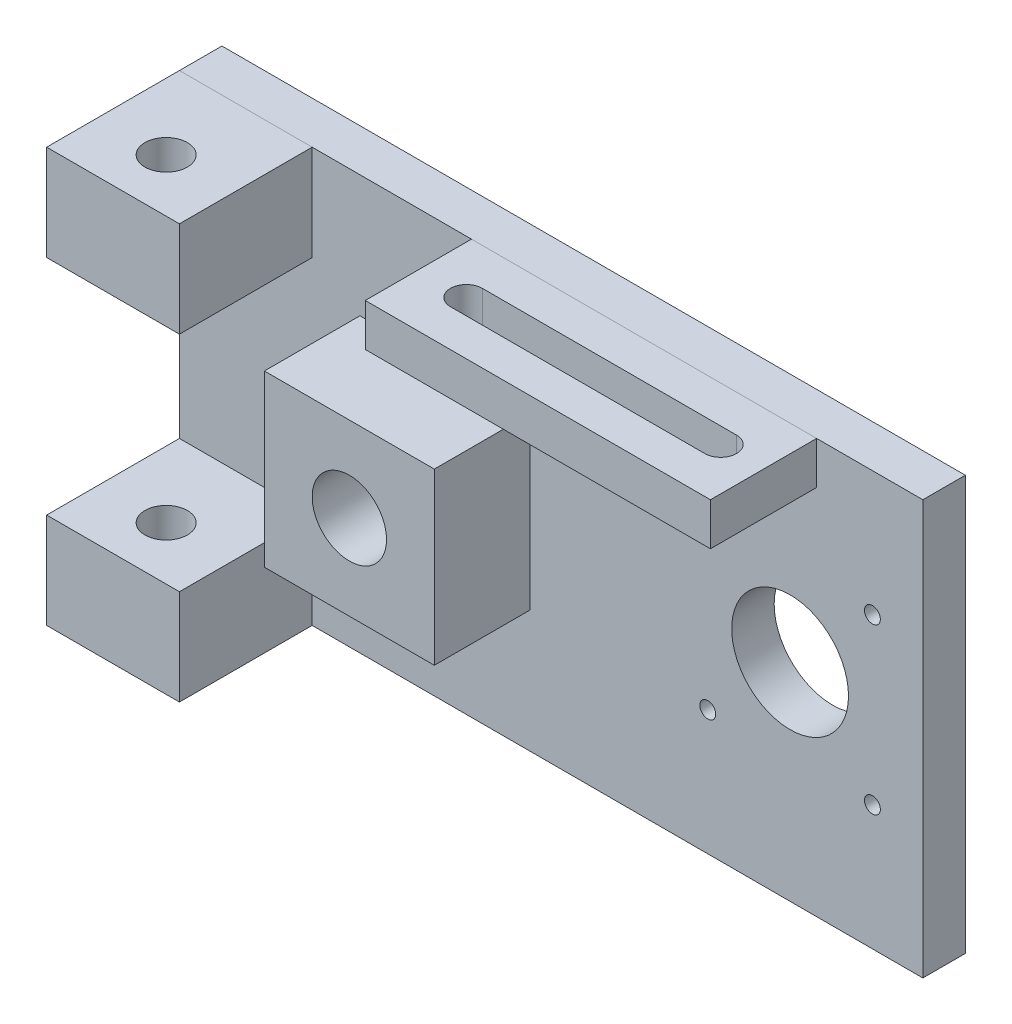
ISO-10303-21;
HEADER;
FILE_DESCRIPTION(('STEP AP214'),'2;1');
FILE_NAME('part.step','',(''),(''),'','','');
FILE_SCHEMA(('AUTOMOTIVE_DESIGN { 1 0 10303 214 1 1 1 1 }'));
ENDSEC;
DATA;
#1=APPLICATION_CONTEXT('core data for automotive mechanical design processes');
#2=APPLICATION_PROTOCOL_DEFINITION('international standard','automotive_design',2000,#1);
#3=PRODUCT_CONTEXT('',#1,'mechanical');
#4=PRODUCT('Part','Part','',(#3));
#5=PRODUCT_RELATED_PRODUCT_CATEGORY('part','',(#4));
#6=PRODUCT_DEFINITION_FORMATION('','',#4);
#7=PRODUCT_DEFINITION_CONTEXT('part definition',#1,'design');
#8=PRODUCT_DEFINITION('design','',#6,#7);
#9=PRODUCT_DEFINITION_SHAPE('','',#8);
#10=(LENGTH_UNIT() NAMED_UNIT(*) SI_UNIT(.MILLI.,.METRE.));
#11=(NAMED_UNIT(*) PLANE_ANGLE_UNIT() SI_UNIT($,.RADIAN.));
#12=(NAMED_UNIT(*) SI_UNIT($,.STERADIAN.) SOLID_ANGLE_UNIT());
#13=UNCERTAINTY_MEASURE_WITH_UNIT(LENGTH_MEASURE(1.E-05),#10,'distance_accuracy_value','');
#14=(GEOMETRIC_REPRESENTATION_CONTEXT(3) GLOBAL_UNCERTAINTY_ASSIGNED_CONTEXT((#13)) GLOBAL_UNIT_ASSIGNED_CONTEXT((#10,
#11,#12)) REPRESENTATION_CONTEXT('',''));
#15=CARTESIAN_POINT('',(0.,0.,0.));
#16=DIRECTION('',(0.,0.,1.));
#17=DIRECTION('',(1.,0.,0.));
#18=AXIS2_PLACEMENT_3D('',#15,#16,#17);
#19=CARTESIAN_POINT('',(50.,39.,28.));
#20=DIRECTION('',(-1.,0.,0.));
#21=DIRECTION('',(0.,0.,1.));
#22=AXIS2_PLACEMENT_3D('',#19,#20,#21);
#23=PLANE('',#22);
#24=DIRECTION('',(0.,1.,0.));
#25=VECTOR('',#24,1.);
#26=CARTESIAN_POINT('',(50.,39.,8.));
#27=LINE('',#26,#25);
#28=CARTESIAN_POINT('',(50.,31.,8.));
#29=VERTEX_POINT('',#28);
#30=CARTESIAN_POINT('',(50.,39.,8.));
#31=VERTEX_POINT('',#30);
#32=EDGE_CURVE('E124',#29,#31,#27,.T.);
#33=ORIENTED_EDGE('',*,*,#32,.T.);
#34=DIRECTION('',(0.,0.,-1.));
#35=VECTOR('',#34,1.);
#36=CARTESIAN_POINT('',(50.,39.,28.));
#37=LINE('',#36,#35);
#38=CARTESIAN_POINT('',(50.,39.,28.));
#39=VERTEX_POINT('',#38);
#40=EDGE_CURVE('E12',#39,#31,#37,.T.);
#41=ORIENTED_EDGE('',*,*,#40,.F.);
#42=DIRECTION('',(0.,1.,0.));
#43=VECTOR('',#42,1.);
#44=CARTESIAN_POINT('',(50.,39.,28.));
#45=LINE('',#44,#43);
#46=CARTESIAN_POINT('',(50.,31.,28.));
#47=VERTEX_POINT('',#46);
#48=EDGE_CURVE('E147',#47,#39,#45,.T.);
#49=ORIENTED_EDGE('',*,*,#48,.F.);
#50=DIRECTION('',(0.,0.,-1.));
#51=VECTOR('',#50,1.);
#52=CARTESIAN_POINT('',(50.,31.,28.));
#53=LINE('',#52,#51);
#54=EDGE_CURVE('E157',#47,#29,#53,.T.);
#55=ORIENTED_EDGE('',*,*,#54,.T.);
#56=EDGE_LOOP('',(#33,#41,#49,#55));
#57=FACE_BOUND('',#56,.T.);
#58=ADVANCED_FACE('F46',(#57),#23,.F.);
#59=CARTESIAN_POINT('',(50.,39.,28.));
#60=DIRECTION('',(0.,-1.,0.));
#61=DIRECTION('',(1.,0.,0.));
#62=AXIS2_PLACEMENT_3D('',#59,#60,#61);
#63=PLANE('',#62);
#64=DIRECTION('',(1.,0.,0.));
#65=VECTOR('',#64,1.);
#66=CARTESIAN_POINT('',(0.,39.,21.));
#67=LINE('',#66,#65);
#68=CARTESIAN_POINT('',(-5.96023281197292,39.,21.));
#69=VERTEX_POINT('',#68);
#70=CARTESIAN_POINT('',(41.9236714740469,39.,21.));
#71=VERTEX_POINT('',#70);
#72=EDGE_CURVE('E132',#69,#71,#67,.T.);
#73=ORIENTED_EDGE('',*,*,#72,.F.);
#74=CARTESIAN_POINT('',(-5.96023281197292,39.,18.));
#75=DIRECTION('',(0.,1.,0.));
#76=DIRECTION('',(-1.,0.,0.));
#77=AXIS2_PLACEMENT_3D('',#74,#75,#76);
#78=CIRCLE('',#77,3.);
#79=CARTESIAN_POINT('',(-5.96023281197292,39.,15.));
#80=VERTEX_POINT('',#79);
#81=EDGE_CURVE('E60',#80,#69,#78,.T.);
#82=ORIENTED_EDGE('',*,*,#81,.F.);
#83=DIRECTION('',(1.,0.,0.));
#84=VECTOR('',#83,1.);
#85=CARTESIAN_POINT('',(0.,39.,15.));
#86=LINE('',#85,#84);
#87=CARTESIAN_POINT('',(41.9236714740469,39.,15.));
#88=VERTEX_POINT('',#87);
#89=EDGE_CURVE('E118',#80,#88,#86,.T.);
#90=ORIENTED_EDGE('',*,*,#89,.T.);
#91=CARTESIAN_POINT('',(41.9236714740469,39.,18.));
#92=DIRECTION('',(0.,1.,0.));
#93=DIRECTION('',(-1.,0.,0.));
#94=AXIS2_PLACEMENT_3D('',#91,#92,#93);
#95=CIRCLE('',#94,3.);
#96=EDGE_CURVE('E138',#71,#88,#95,.T.);
#97=ORIENTED_EDGE('',*,*,#96,.F.);
#98=EDGE_LOOP('',(#73,#82,#90,#97));
#99=FACE_BOUND('',#98,.T.);
#100=DIRECTION('',(-1.,0.,0.));
#101=VECTOR('',#100,1.);
#102=CARTESIAN_POINT('',(50.,39.,8.));
#103=LINE('',#102,#101);
#104=CARTESIAN_POINT('',(-15.,39.,8.));
#105=VERTEX_POINT('',#104);
#106=EDGE_CURVE('E160',#31,#105,#103,.T.);
#107=ORIENTED_EDGE('',*,*,#106,.T.);
#108=DIRECTION('',(0.,0.,-1.));
#109=VECTOR('',#108,1.);
#110=CARTESIAN_POINT('',(-15.,39.,28.));
#111=LINE('',#110,#109);
#112=CARTESIAN_POINT('',(-15.,39.,28.));
#113=VERTEX_POINT('',#112);
#114=EDGE_CURVE('E53',#113,#105,#111,.T.);
#115=ORIENTED_EDGE('',*,*,#114,.F.);
#116=DIRECTION('',(-1.,0.,0.));
#117=VECTOR('',#116,1.);
#118=CARTESIAN_POINT('',(50.,39.,28.));
#119=LINE('',#118,#117);
#120=EDGE_CURVE('E150',#39,#113,#119,.T.);
#121=ORIENTED_EDGE('',*,*,#120,.F.);
#122=ORIENTED_EDGE('',*,*,#40,.T.);
#123=EDGE_LOOP('',(#107,#115,#121,#122));
#124=FACE_BOUND('',#123,.T.);
#125=ADVANCED_FACE('F188',(#99,#124),#63,.F.);
#126=CARTESIAN_POINT('',(-15.,39.,28.));
#127=DIRECTION('',(1.,0.,0.));
#128=DIRECTION('',(0.,0.,-1.));
#129=AXIS2_PLACEMENT_3D('',#126,#127,#128);
#130=PLANE('',#129);
#131=DIRECTION('',(0.,-1.,0.));
#132=VECTOR('',#131,1.);
#133=CARTESIAN_POINT('',(-15.,39.,8.));
#134=LINE('',#133,#132);
#135=CARTESIAN_POINT('',(-15.,31.,8.));
#136=VERTEX_POINT('',#135);
#137=EDGE_CURVE('E162',#105,#136,#134,.T.);
#138=ORIENTED_EDGE('',*,*,#137,.T.);
#139=DIRECTION('',(0.,0.,-1.));
#140=VECTOR('',#139,1.);
#141=CARTESIAN_POINT('',(-15.,31.,28.));
#142=LINE('',#141,#140);
#143=CARTESIAN_POINT('',(-15.,31.,28.));
#144=VERTEX_POINT('',#143);
#145=EDGE_CURVE('E167',#144,#136,#142,.T.);
#146=ORIENTED_EDGE('',*,*,#145,.F.);
#147=DIRECTION('',(0.,-1.,0.));
#148=VECTOR('',#147,1.);
#149=CARTESIAN_POINT('',(-15.,39.,28.));
#150=LINE('',#149,#148);
#151=EDGE_CURVE('E153',#113,#144,#150,.T.);
#152=ORIENTED_EDGE('',*,*,#151,.F.);
#153=ORIENTED_EDGE('',*,*,#114,.T.);
#154=EDGE_LOOP('',(#138,#146,#152,#153));
#155=FACE_BOUND('',#154,.T.);
#156=ADVANCED_FACE('F174',(#155),#130,.F.);
#157=CARTESIAN_POINT('',(50.,31.,28.));
#158=DIRECTION('',(0.,1.,0.));
#159=DIRECTION('',(-1.,0.,0.));
#160=AXIS2_PLACEMENT_3D('',#157,#158,#159);
#161=PLANE('',#160);
#162=DIRECTION('',(-1.,0.,0.));
#163=VECTOR('',#162,1.);
#164=CARTESIAN_POINT('',(0.,31.,15.));
#165=LINE('',#164,#163);
#166=CARTESIAN_POINT('',(41.9236714740469,31.,15.));
#167=VERTEX_POINT('',#166);
#168=CARTESIAN_POINT('',(-5.96023281197292,31.,15.));
#169=VERTEX_POINT('',#168);
#170=EDGE_CURVE('E130',#167,#169,#165,.T.);
#171=ORIENTED_EDGE('',*,*,#170,.T.);
#172=CARTESIAN_POINT('',(-5.96023281197292,31.,18.));
#173=DIRECTION('',(0.,1.,0.));
#174=DIRECTION('',(-1.,0.,0.));
#175=AXIS2_PLACEMENT_3D('',#172,#173,#174);
#176=CIRCLE('',#175,3.);
#177=CARTESIAN_POINT('',(-5.96023281197292,31.,21.));
#178=VERTEX_POINT('',#177);
#179=EDGE_CURVE('E112',#178,#169,#176,.F.);
#180=ORIENTED_EDGE('',*,*,#179,.F.);
#181=DIRECTION('',(-1.,0.,0.));
#182=VECTOR('',#181,1.);
#183=CARTESIAN_POINT('',(0.,31.,21.));
#184=LINE('',#183,#182);
#185=CARTESIAN_POINT('',(41.9236714740469,31.,21.));
#186=VERTEX_POINT('',#185);
#187=EDGE_CURVE('E121',#186,#178,#184,.T.);
#188=ORIENTED_EDGE('',*,*,#187,.F.);
#189=CARTESIAN_POINT('',(41.9236714740469,31.,18.));
#190=DIRECTION('',(0.,1.,0.));
#191=DIRECTION('',(-1.,0.,0.));
#192=AXIS2_PLACEMENT_3D('',#189,#190,#191);
#193=CIRCLE('',#192,3.);
#194=EDGE_CURVE('E68',#167,#186,#193,.F.);
#195=ORIENTED_EDGE('',*,*,#194,.F.);
#196=EDGE_LOOP('',(#171,#180,#188,#195));
#197=FACE_BOUND('',#196,.T.);
#198=DIRECTION('',(1.,0.,0.));
#199=VECTOR('',#198,1.);
#200=CARTESIAN_POINT('',(50.,31.,8.));
#201=LINE('',#200,#199);
#202=EDGE_CURVE('E151',#136,#29,#201,.T.);
#203=ORIENTED_EDGE('',*,*,#202,.T.);
#204=ORIENTED_EDGE('',*,*,#54,.F.);
#205=DIRECTION('',(1.,0.,0.));
#206=VECTOR('',#205,1.);
#207=CARTESIAN_POINT('',(50.,31.,28.));
#208=LINE('',#207,#206);
#209=EDGE_CURVE('E155',#144,#47,#208,.T.);
#210=ORIENTED_EDGE('',*,*,#209,.F.);
#211=ORIENTED_EDGE('',*,*,#145,.T.);
#212=EDGE_LOOP('',(#203,#204,#210,#211));
#213=FACE_BOUND('',#212,.T.);
#214=ADVANCED_FACE('F127',(#197,#213),#161,.F.);
#215=CARTESIAN_POINT('',(0.,0.,28.));
#216=DIRECTION('',(0.,0.,-1.));
#217=DIRECTION('',(-1.,0.,0.));
#218=AXIS2_PLACEMENT_3D('',#215,#216,#217);
#219=PLANE('',#218);
#220=ORIENTED_EDGE('',*,*,#48,.T.);
#221=ORIENTED_EDGE('',*,*,#120,.T.);
#222=ORIENTED_EDGE('',*,*,#151,.T.);
#223=ORIENTED_EDGE('',*,*,#209,.T.);
#224=EDGE_LOOP('',(#220,#221,#222,#223));
#225=FACE_BOUND('',#224,.T.);
#226=ADVANCED_FACE('F187',(#225),#219,.F.);
#227=CARTESIAN_POINT('',(0.,0.,8.));
#228=DIRECTION('',(0.,0.,-1.));
#229=DIRECTION('',(-1.,0.,0.));
#230=AXIS2_PLACEMENT_3D('',#227,#228,#229);
#231=PLANE('',#230);
#232=ORIENTED_EDGE('',*,*,#32,.F.);
#233=ORIENTED_EDGE('',*,*,#202,.F.);
#234=ORIENTED_EDGE('',*,*,#137,.F.);
#235=ORIENTED_EDGE('',*,*,#106,.F.);
#236=EDGE_LOOP('',(#232,#233,#234,#235));
#237=FACE_BOUND('',#236,.T.);
#238=ADVANCED_FACE('F180',(#237),#231,.T.);
#239=CARTESIAN_POINT('',(-5.96023281197291,-39.001,18.));
#240=DIRECTION('',(0.,1.,0.));
#241=DIRECTION('',(-1.,0.,0.));
#242=AXIS2_PLACEMENT_3D('',#239,#240,#241);
#243=CYLINDRICAL_SURFACE('',#242,3.);
#244=ORIENTED_EDGE('',*,*,#179,.T.);
#245=DIRECTION('',(0.,1.,0.));
#246=VECTOR('',#245,1.);
#247=CARTESIAN_POINT('',(-5.96023281197291,-39.001,15.));
#248=LINE('',#247,#246);
#249=EDGE_CURVE('E125',#169,#80,#248,.T.);
#250=ORIENTED_EDGE('',*,*,#249,.T.);
#251=ORIENTED_EDGE('',*,*,#81,.T.);
#252=DIRECTION('',(0.,1.,0.));
#253=VECTOR('',#252,1.);
#254=CARTESIAN_POINT('',(-5.96023281197291,-39.001,21.));
#255=LINE('',#254,#253);
#256=EDGE_CURVE('E108',#178,#69,#255,.T.);
#257=ORIENTED_EDGE('',*,*,#256,.F.);
#258=EDGE_LOOP('',(#244,#250,#251,#257));
#259=FACE_BOUND('',#258,.T.);
#260=ADVANCED_FACE('F110',(#259),#243,.F.);
#261=CARTESIAN_POINT('',(0.,-39.001,15.));
#262=DIRECTION('',(0.,0.,1.));
#263=DIRECTION('',(1.,0.,0.));
#264=AXIS2_PLACEMENT_3D('',#261,#262,#263);
#265=PLANE('',#264);
#266=DIRECTION('',(0.,1.,0.));
#267=VECTOR('',#266,1.);
#268=CARTESIAN_POINT('',(41.9236714740469,-39.001,15.));
#269=LINE('',#268,#267);
#270=EDGE_CURVE('E144',#167,#88,#269,.T.);
#271=ORIENTED_EDGE('',*,*,#270,.T.);
#272=ORIENTED_EDGE('',*,*,#89,.F.);
#273=ORIENTED_EDGE('',*,*,#249,.F.);
#274=ORIENTED_EDGE('',*,*,#170,.F.);
#275=EDGE_LOOP('',(#271,#272,#273,#274));
#276=FACE_BOUND('',#275,.T.);
#277=ADVANCED_FACE('F205',(#276),#265,.T.);
#278=CARTESIAN_POINT('',(41.9236714740469,-39.001,18.));
#279=DIRECTION('',(0.,1.,0.));
#280=DIRECTION('',(-1.,0.,0.));
#281=AXIS2_PLACEMENT_3D('',#278,#279,#280);
#282=CYLINDRICAL_SURFACE('',#281,3.);
#283=ORIENTED_EDGE('',*,*,#194,.T.);
#284=DIRECTION('',(0.,1.,0.));
#285=VECTOR('',#284,1.);
#286=CARTESIAN_POINT('',(41.9236714740469,-39.001,21.));
#287=LINE('',#286,#285);
#288=EDGE_CURVE('E117',#186,#71,#287,.T.);
#289=ORIENTED_EDGE('',*,*,#288,.T.);
#290=ORIENTED_EDGE('',*,*,#96,.T.);
#291=ORIENTED_EDGE('',*,*,#270,.F.);
#292=EDGE_LOOP('',(#283,#289,#290,#291));
#293=FACE_BOUND('',#292,.T.);
#294=ADVANCED_FACE('F208',(#293),#282,.F.);
#295=CARTESIAN_POINT('',(0.,-39.001,21.));
#296=DIRECTION('',(0.,0.,1.));
#297=DIRECTION('',(1.,0.,0.));
#298=AXIS2_PLACEMENT_3D('',#295,#296,#297);
#299=PLANE('',#298);
#300=ORIENTED_EDGE('',*,*,#187,.T.);
#301=ORIENTED_EDGE('',*,*,#256,.T.);
#302=ORIENTED_EDGE('',*,*,#72,.T.);
#303=ORIENTED_EDGE('',*,*,#288,.F.);
#304=EDGE_LOOP('',(#300,#301,#302,#303));
#305=FACE_BOUND('',#304,.T.);
#306=ADVANCED_FACE('F122',(#305),#299,.F.);
#307=CLOSED_SHELL('',(#58,#125,#156,#214,#226,#238,#260,#277,#294,#306));
#308=MANIFOLD_SOLID_BREP('B2',#307);
#309=CARTESIAN_POINT('',(0.,-39.,33.));
#310=DIRECTION('',(0.,1.,0.));
#311=DIRECTION('',(0.,0.,1.));
#312=AXIS2_PLACEMENT_3D('',#309,#310,#311);
#313=PLANE('',#312);
#314=CARTESIAN_POINT('',(-57.5,-39.,23.0000000000002));
#315=DIRECTION('',(0.,1.,0.));
#316=DIRECTION('',(0.,0.,1.));
#317=AXIS2_PLACEMENT_3D('',#314,#315,#316);
#318=CIRCLE('',#317,4.00000000000001);
#319=CARTESIAN_POINT('',(-57.5,-39.,27.0000000000002));
#320=VERTEX_POINT('',#319);
#321=EDGE_CURVE('E381',#320,#320,#318,.T.);
#322=ORIENTED_EDGE('',*,*,#321,.T.);
#323=EDGE_LOOP('',(#322));
#324=FACE_BOUND('',#323,.T.);
#325=DIRECTION('',(1.,0.,0.));
#326=VECTOR('',#325,1.);
#327=CARTESIAN_POINT('',(0.,-39.,8.));
#328=LINE('',#327,#326);
#329=CARTESIAN_POINT('',(-70.,-39.,8.));
#330=VERTEX_POINT('',#329);
#331=CARTESIAN_POINT('',(-45.,-39.,8.));
#332=VERTEX_POINT('',#331);
#333=EDGE_CURVE('E350',#330,#332,#328,.T.);
#334=ORIENTED_EDGE('',*,*,#333,.T.);
#335=DIRECTION('',(0.,0.,-1.));
#336=VECTOR('',#335,1.);
#337=CARTESIAN_POINT('',(-45.,-39.,33.));
#338=LINE('',#337,#336);
#339=CARTESIAN_POINT('',(-45.,-39.,33.));
#340=VERTEX_POINT('',#339);
#341=EDGE_CURVE('E44',#340,#332,#338,.T.);
#342=ORIENTED_EDGE('',*,*,#341,.F.);
#343=DIRECTION('',(1.,0.,0.));
#344=VECTOR('',#343,1.);
#345=CARTESIAN_POINT('',(0.,-39.,33.));
#346=LINE('',#345,#344);
#347=CARTESIAN_POINT('',(-70.,-39.,33.));
#348=VERTEX_POINT('',#347);
#349=EDGE_CURVE('E334',#348,#340,#346,.T.);
#350=ORIENTED_EDGE('',*,*,#349,.F.);
#351=DIRECTION('',(0.,0.,-1.));
#352=VECTOR('',#351,1.);
#353=CARTESIAN_POINT('',(-70.,-39.,33.));
#354=LINE('',#353,#352);
#355=EDGE_CURVE('E346',#348,#330,#354,.T.);
#356=ORIENTED_EDGE('',*,*,#355,.T.);
#357=EDGE_LOOP('',(#334,#342,#350,#356));
#358=FACE_BOUND('',#357,.T.);
#359=ADVANCED_FACE('F286',(#324,#358),#313,.F.);
#360=CARTESIAN_POINT('',(-45.,0.,33.));
#361=DIRECTION('',(-1.,0.,0.));
#362=DIRECTION('',(0.,0.,1.));
#363=AXIS2_PLACEMENT_3D('',#360,#361,#362);
#364=PLANE('',#363);
#365=DIRECTION('',(0.,1.,0.));
#366=VECTOR('',#365,1.);
#367=CARTESIAN_POINT('',(-45.,0.,8.));
#368=LINE('',#367,#366);
#369=CARTESIAN_POINT('',(-45.,-21.,8.));
#370=VERTEX_POINT('',#369);
#371=EDGE_CURVE('E339',#332,#370,#368,.T.);
#372=ORIENTED_EDGE('',*,*,#371,.T.);
#373=DIRECTION('',(0.,0.,-1.));
#374=VECTOR('',#373,1.);
#375=CARTESIAN_POINT('',(-45.,-21.,33.));
#376=LINE('',#375,#374);
#377=CARTESIAN_POINT('',(-45.,-21.,33.));
#378=VERTEX_POINT('',#377);
#379=EDGE_CURVE('E295',#378,#370,#376,.T.);
#380=ORIENTED_EDGE('',*,*,#379,.F.);
#381=DIRECTION('',(0.,1.,0.));
#382=VECTOR('',#381,1.);
#383=CARTESIAN_POINT('',(-45.,0.,33.));
#384=LINE('',#383,#382);
#385=EDGE_CURVE('E329',#340,#378,#384,.T.);
#386=ORIENTED_EDGE('',*,*,#385,.F.);
#387=ORIENTED_EDGE('',*,*,#341,.T.);
#388=EDGE_LOOP('',(#372,#380,#386,#387));
#389=FACE_BOUND('',#388,.T.);
#390=ADVANCED_FACE('F338',(#389),#364,.F.);
#391=CARTESIAN_POINT('',(0.,-21.,33.));
#392=DIRECTION('',(0.,1.,0.));
#393=DIRECTION('',(-1.,0.,0.));
#394=AXIS2_PLACEMENT_3D('',#391,#392,#393);
#395=PLANE('',#394);
#396=CARTESIAN_POINT('',(-57.5,-21.,23.0000000000002));
#397=DIRECTION('',(0.,1.,0.));
#398=DIRECTION('',(-1.,0.,0.));
#399=AXIS2_PLACEMENT_3D('',#396,#397,#398);
#400=CIRCLE('',#399,4.00000000000001);
#401=CARTESIAN_POINT('',(-61.5,-21.,23.0000000000002));
#402=VERTEX_POINT('',#401);
#403=EDGE_CURVE('E289',#402,#402,#400,.T.);
#404=ORIENTED_EDGE('',*,*,#403,.F.);
#405=EDGE_LOOP('',(#404));
#406=FACE_BOUND('',#405,.T.);
#407=DIRECTION('',(1.,0.,0.));
#408=VECTOR('',#407,1.);
#409=CARTESIAN_POINT('',(0.,-21.,8.));
#410=LINE('',#409,#408);
#411=CARTESIAN_POINT('',(-70.,-21.,8.));
#412=VERTEX_POINT('',#411);
#413=EDGE_CURVE('E354',#412,#370,#410,.T.);
#414=ORIENTED_EDGE('',*,*,#413,.F.);
#415=DIRECTION('',(0.,0.,-1.));
#416=VECTOR('',#415,1.);
#417=CARTESIAN_POINT('',(-70.,-21.,33.));
#418=LINE('',#417,#416);
#419=CARTESIAN_POINT('',(-70.,-21.,33.));
#420=VERTEX_POINT('',#419);
#421=EDGE_CURVE('E319',#420,#412,#418,.T.);
#422=ORIENTED_EDGE('',*,*,#421,.F.);
#423=DIRECTION('',(1.,0.,0.));
#424=VECTOR('',#423,1.);
#425=CARTESIAN_POINT('',(0.,-21.,33.));
#426=LINE('',#425,#424);
#427=EDGE_CURVE('E332',#420,#378,#426,.T.);
#428=ORIENTED_EDGE('',*,*,#427,.T.);
#429=ORIENTED_EDGE('',*,*,#379,.T.);
#430=EDGE_LOOP('',(#414,#422,#428,#429));
#431=FACE_BOUND('',#430,.T.);
#432=ADVANCED_FACE('F344',(#406,#431),#395,.T.);
#433=CARTESIAN_POINT('',(-70.,0.,33.));
#434=DIRECTION('',(1.,0.,0.));
#435=DIRECTION('',(0.,0.,-1.));
#436=AXIS2_PLACEMENT_3D('',#433,#434,#435);
#437=PLANE('',#436);
#438=DIRECTION('',(0.,-1.,0.));
#439=VECTOR('',#438,1.);
#440=CARTESIAN_POINT('',(-70.,0.,8.));
#441=LINE('',#440,#439);
#442=EDGE_CURVE('E322',#412,#330,#441,.T.);
#443=ORIENTED_EDGE('',*,*,#442,.T.);
#444=ORIENTED_EDGE('',*,*,#355,.F.);
#445=DIRECTION('',(0.,-1.,0.));
#446=VECTOR('',#445,1.);
#447=CARTESIAN_POINT('',(-70.,0.,33.));
#448=LINE('',#447,#446);
#449=EDGE_CURVE('E303',#420,#348,#448,.T.);
#450=ORIENTED_EDGE('',*,*,#449,.F.);
#451=ORIENTED_EDGE('',*,*,#421,.T.);
#452=EDGE_LOOP('',(#443,#444,#450,#451));
#453=FACE_BOUND('',#452,.T.);
#454=ADVANCED_FACE('F371',(#453),#437,.F.);
#455=CARTESIAN_POINT('',(0.,0.,33.));
#456=DIRECTION('',(0.,0.,1.));
#457=DIRECTION('',(1.,0.,0.));
#458=AXIS2_PLACEMENT_3D('',#455,#456,#457);
#459=PLANE('',#458);
#460=ORIENTED_EDGE('',*,*,#349,.T.);
#461=ORIENTED_EDGE('',*,*,#385,.T.);
#462=ORIENTED_EDGE('',*,*,#427,.F.);
#463=ORIENTED_EDGE('',*,*,#449,.T.);
#464=EDGE_LOOP('',(#460,#461,#462,#463));
#465=FACE_BOUND('',#464,.T.);
#466=ADVANCED_FACE('F330',(#465),#459,.T.);
#467=CARTESIAN_POINT('',(0.,0.,8.));
#468=DIRECTION('',(0.,0.,1.));
#469=DIRECTION('',(1.,0.,0.));
#470=AXIS2_PLACEMENT_3D('',#467,#468,#469);
#471=PLANE('',#470);
#472=ORIENTED_EDGE('',*,*,#333,.F.);
#473=ORIENTED_EDGE('',*,*,#442,.F.);
#474=ORIENTED_EDGE('',*,*,#413,.T.);
#475=ORIENTED_EDGE('',*,*,#371,.F.);
#476=EDGE_LOOP('',(#472,#473,#474,#475));
#477=FACE_BOUND('',#476,.T.);
#478=ADVANCED_FACE('F361',(#477),#471,.F.);
#479=CARTESIAN_POINT('',(-57.5,-39.,23.0000000000002));
#480=DIRECTION('',(0.,1.,0.));
#481=DIRECTION('',(0.,0.,1.));
#482=AXIS2_PLACEMENT_3D('',#479,#480,#481);
#483=CYLINDRICAL_SURFACE('',#482,4.00000000000001);
#484=ORIENTED_EDGE('',*,*,#403,.T.);
#485=EDGE_LOOP('',(#484));
#486=FACE_BOUND('',#485,.T.);
#487=ORIENTED_EDGE('',*,*,#321,.F.);
#488=EDGE_LOOP('',(#487));
#489=FACE_BOUND('',#488,.T.);
#490=ADVANCED_FACE('F363',(#486,#489),#483,.F.);
#491=CLOSED_SHELL('',(#359,#390,#432,#454,#466,#478,#490));
#492=MANIFOLD_SOLID_BREP('B6',#491);
#493=CARTESIAN_POINT('',(-45.,0.,33.));
#494=DIRECTION('',(1.,0.,0.));
#495=DIRECTION('',(0.,1.,0.));
#496=AXIS2_PLACEMENT_3D('',#493,#494,#495);
#497=PLANE('',#496);
#498=DIRECTION('',(0.,-1.,0.));
#499=VECTOR('',#498,1.);
#500=CARTESIAN_POINT('',(-45.,0.,8.));
#501=LINE('',#500,#499);
#502=CARTESIAN_POINT('',(-45.,39.,8.));
#503=VERTEX_POINT('',#502);
#504=CARTESIAN_POINT('',(-45.,21.,8.));
#505=VERTEX_POINT('',#504);
#506=EDGE_CURVE('E510',#503,#505,#501,.T.);
#507=ORIENTED_EDGE('',*,*,#506,.F.);
#508=DIRECTION('',(0.,0.,-1.));
#509=VECTOR('',#508,1.);
#510=CARTESIAN_POINT('',(-45.,39.,33.));
#511=LINE('',#510,#509);
#512=CARTESIAN_POINT('',(-45.,39.,33.));
#513=VERTEX_POINT('',#512);
#514=EDGE_CURVE('E284',#513,#503,#511,.T.);
#515=ORIENTED_EDGE('',*,*,#514,.F.);
#516=DIRECTION('',(0.,-1.,0.));
#517=VECTOR('',#516,1.);
#518=CARTESIAN_POINT('',(-45.,0.,33.));
#519=LINE('',#518,#517);
#520=CARTESIAN_POINT('',(-45.,21.,33.));
#521=VERTEX_POINT('',#520);
#522=EDGE_CURVE('E497',#513,#521,#519,.T.);
#523=ORIENTED_EDGE('',*,*,#522,.T.);
#524=DIRECTION('',(0.,0.,-1.));
#525=VECTOR('',#524,1.);
#526=CARTESIAN_POINT('',(-45.,21.,33.));
#527=LINE('',#526,#525);
#528=EDGE_CURVE('E486',#521,#505,#527,.T.);
#529=ORIENTED_EDGE('',*,*,#528,.T.);
#530=EDGE_LOOP('',(#507,#515,#523,#529));
#531=FACE_BOUND('',#530,.T.);
#532=ADVANCED_FACE('F446',(#531),#497,.T.);
#533=CARTESIAN_POINT('',(0.,39.,33.));
#534=DIRECTION('',(0.,-1.,0.));
#535=DIRECTION('',(0.,0.,-1.));
#536=AXIS2_PLACEMENT_3D('',#533,#534,#535);
#537=PLANE('',#536);
#538=CARTESIAN_POINT('',(-57.5,39.,23.0000000000002));
#539=DIRECTION('',(0.,1.,0.));
#540=DIRECTION('',(0.,0.,1.));
#541=AXIS2_PLACEMENT_3D('',#538,#539,#540);
#542=CIRCLE('',#541,4.00000000000001);
#543=CARTESIAN_POINT('',(-57.5,39.,27.0000000000002));
#544=VERTEX_POINT('',#543);
#545=EDGE_CURVE('E548',#544,#544,#542,.T.);
#546=ORIENTED_EDGE('',*,*,#545,.F.);
#547=EDGE_LOOP('',(#546));
#548=FACE_BOUND('',#547,.T.);
#549=DIRECTION('',(-1.,0.,0.));
#550=VECTOR('',#549,1.);
#551=CARTESIAN_POINT('',(0.,39.,8.));
#552=LINE('',#551,#550);
#553=CARTESIAN_POINT('',(-70.,39.,8.));
#554=VERTEX_POINT('',#553);
#555=EDGE_CURVE('E502',#503,#554,#552,.T.);
#556=ORIENTED_EDGE('',*,*,#555,.T.);
#557=DIRECTION('',(0.,0.,-1.));
#558=VECTOR('',#557,1.);
#559=CARTESIAN_POINT('',(-70.,39.,33.));
#560=LINE('',#559,#558);
#561=CARTESIAN_POINT('',(-70.,39.,33.));
#562=VERTEX_POINT('',#561);
#563=EDGE_CURVE('E455',#562,#554,#560,.T.);
#564=ORIENTED_EDGE('',*,*,#563,.F.);
#565=DIRECTION('',(-1.,0.,0.));
#566=VECTOR('',#565,1.);
#567=CARTESIAN_POINT('',(0.,39.,33.));
#568=LINE('',#567,#566);
#569=EDGE_CURVE('E492',#513,#562,#568,.T.);
#570=ORIENTED_EDGE('',*,*,#569,.F.);
#571=ORIENTED_EDGE('',*,*,#514,.T.);
#572=EDGE_LOOP('',(#556,#564,#570,#571));
#573=FACE_BOUND('',#572,.T.);
#574=ADVANCED_FACE('F500',(#548,#573),#537,.F.);
#575=CARTESIAN_POINT('',(-70.,0.,33.));
#576=DIRECTION('',(1.,0.,0.));
#577=DIRECTION('',(0.,0.,-1.));
#578=AXIS2_PLACEMENT_3D('',#575,#576,#577);
#579=PLANE('',#578);
#580=DIRECTION('',(0.,-1.,0.));
#581=VECTOR('',#580,1.);
#582=CARTESIAN_POINT('',(-70.,0.,8.));
#583=LINE('',#582,#581);
#584=CARTESIAN_POINT('',(-70.,21.,8.));
#585=VERTEX_POINT('',#584);
#586=EDGE_CURVE('E479',#554,#585,#583,.T.);
#587=ORIENTED_EDGE('',*,*,#586,.T.);
#588=DIRECTION('',(0.,0.,-1.));
#589=VECTOR('',#588,1.);
#590=CARTESIAN_POINT('',(-70.,21.,33.));
#591=LINE('',#590,#589);
#592=CARTESIAN_POINT('',(-70.,21.,33.));
#593=VERTEX_POINT('',#592);
#594=EDGE_CURVE('E503',#593,#585,#591,.T.);
#595=ORIENTED_EDGE('',*,*,#594,.F.);
#596=DIRECTION('',(0.,-1.,0.));
#597=VECTOR('',#596,1.);
#598=CARTESIAN_POINT('',(-70.,0.,33.));
#599=LINE('',#598,#597);
#600=EDGE_CURVE('E496',#562,#593,#599,.T.);
#601=ORIENTED_EDGE('',*,*,#600,.F.);
#602=ORIENTED_EDGE('',*,*,#563,.T.);
#603=EDGE_LOOP('',(#587,#595,#601,#602));
#604=FACE_BOUND('',#603,.T.);
#605=ADVANCED_FACE('F505',(#604),#579,.F.);
#606=CARTESIAN_POINT('',(0.,21.,33.));
#607=DIRECTION('',(0.,1.,0.));
#608=DIRECTION('',(0.,0.,1.));
#609=AXIS2_PLACEMENT_3D('',#606,#607,#608);
#610=PLANE('',#609);
#611=CARTESIAN_POINT('',(-57.5,21.,23.0000000000002));
#612=DIRECTION('',(0.,1.,0.));
#613=DIRECTION('',(0.,0.,1.));
#614=AXIS2_PLACEMENT_3D('',#611,#612,#613);
#615=CIRCLE('',#614,4.00000000000001);
#616=CARTESIAN_POINT('',(-57.5,21.,27.0000000000002));
#617=VERTEX_POINT('',#616);
#618=EDGE_CURVE('E449',#617,#617,#615,.T.);
#619=ORIENTED_EDGE('',*,*,#618,.T.);
#620=EDGE_LOOP('',(#619));
#621=FACE_BOUND('',#620,.T.);
#622=DIRECTION('',(1.,0.,0.));
#623=VECTOR('',#622,1.);
#624=CARTESIAN_POINT('',(0.,21.,8.));
#625=LINE('',#624,#623);
#626=EDGE_CURVE('E515',#585,#505,#625,.T.);
#627=ORIENTED_EDGE('',*,*,#626,.T.);
#628=ORIENTED_EDGE('',*,*,#528,.F.);
#629=DIRECTION('',(1.,0.,0.));
#630=VECTOR('',#629,1.);
#631=CARTESIAN_POINT('',(0.,21.,33.));
#632=LINE('',#631,#630);
#633=EDGE_CURVE('E463',#593,#521,#632,.T.);
#634=ORIENTED_EDGE('',*,*,#633,.F.);
#635=ORIENTED_EDGE('',*,*,#594,.T.);
#636=EDGE_LOOP('',(#627,#628,#634,#635));
#637=FACE_BOUND('',#636,.T.);
#638=ADVANCED_FACE('F520',(#621,#637),#610,.F.);
#639=CARTESIAN_POINT('',(0.,0.,33.));
#640=DIRECTION('',(0.,0.,1.));
#641=DIRECTION('',(1.,0.,0.));
#642=AXIS2_PLACEMENT_3D('',#639,#640,#641);
#643=PLANE('',#642);
#644=ORIENTED_EDGE('',*,*,#522,.F.);
#645=ORIENTED_EDGE('',*,*,#569,.T.);
#646=ORIENTED_EDGE('',*,*,#600,.T.);
#647=ORIENTED_EDGE('',*,*,#633,.T.);
#648=EDGE_LOOP('',(#644,#645,#646,#647));
#649=FACE_BOUND('',#648,.T.);
#650=ADVANCED_FACE('F494',(#649),#643,.T.);
#651=CARTESIAN_POINT('',(0.,0.,8.));
#652=DIRECTION('',(0.,0.,1.));
#653=DIRECTION('',(1.,0.,0.));
#654=AXIS2_PLACEMENT_3D('',#651,#652,#653);
#655=PLANE('',#654);
#656=ORIENTED_EDGE('',*,*,#506,.T.);
#657=ORIENTED_EDGE('',*,*,#626,.F.);
#658=ORIENTED_EDGE('',*,*,#586,.F.);
#659=ORIENTED_EDGE('',*,*,#555,.F.);
#660=EDGE_LOOP('',(#656,#657,#658,#659));
#661=FACE_BOUND('',#660,.T.);
#662=ADVANCED_FACE('F522',(#661),#655,.F.);
#663=CARTESIAN_POINT('',(-57.5,-39.,23.0000000000002));
#664=DIRECTION('',(0.,1.,0.));
#665=DIRECTION('',(0.,0.,1.));
#666=AXIS2_PLACEMENT_3D('',#663,#664,#665);
#667=CYLINDRICAL_SURFACE('',#666,4.00000000000001);
#668=ORIENTED_EDGE('',*,*,#545,.T.);
#669=EDGE_LOOP('',(#668));
#670=FACE_BOUND('',#669,.T.);
#671=ORIENTED_EDGE('',*,*,#618,.F.);
#672=EDGE_LOOP('',(#671));
#673=FACE_BOUND('',#672,.T.);
#674=ADVANCED_FACE('F539',(#670,#673),#667,.F.);
#675=CLOSED_SHELL('',(#532,#574,#605,#638,#650,#662,#674));
#676=MANIFOLD_SOLID_BREP('B38',#675);
#677=CARTESIAN_POINT('',(0.,0.,8.));
#678=DIRECTION('',(0.,0.,-1.));
#679=DIRECTION('',(-1.,0.,0.));
#680=AXIS2_PLACEMENT_3D('',#677,#678,#679);
#681=PLANE('',#680);
#682=DIRECTION('',(0.,1.,0.));
#683=VECTOR('',#682,1.);
#684=CARTESIAN_POINT('',(70.,-39.,8.));
#685=LINE('',#684,#683);
#686=CARTESIAN_POINT('',(70.,-39.,8.));
#687=VERTEX_POINT('',#686);
#688=CARTESIAN_POINT('',(70.,39.,8.));
#689=VERTEX_POINT('',#688);
#690=EDGE_CURVE('E742',#687,#689,#685,.T.);
#691=ORIENTED_EDGE('',*,*,#690,.T.);
#692=DIRECTION('',(-1.,0.,0.));
#693=VECTOR('',#692,1.);
#694=CARTESIAN_POINT('',(-70.,39.,8.));
#695=LINE('',#694,#693);
#696=CARTESIAN_POINT('',(-70.,39.,8.));
#697=VERTEX_POINT('',#696);
#698=EDGE_CURVE('E745',#689,#697,#695,.T.);
#699=ORIENTED_EDGE('',*,*,#698,.T.);
#700=DIRECTION('',(0.,-1.,0.));
#701=VECTOR('',#700,1.);
#702=CARTESIAN_POINT('',(-70.,-39.,8.));
#703=LINE('',#702,#701);
#704=CARTESIAN_POINT('',(-70.,-39.,8.));
#705=VERTEX_POINT('',#704);
#706=EDGE_CURVE('E748',#697,#705,#703,.T.);
#707=ORIENTED_EDGE('',*,*,#706,.T.);
#708=DIRECTION('',(1.,0.,0.));
#709=VECTOR('',#708,1.);
#710=CARTESIAN_POINT('',(-70.,-39.,8.));
#711=LINE('',#710,#709);
#712=EDGE_CURVE('E750',#705,#687,#711,.T.);
#713=ORIENTED_EDGE('',*,*,#712,.T.);
#714=EDGE_LOOP('',(#691,#699,#707,#713));
#715=FACE_BOUND('',#714,.T.);
#716=CARTESIAN_POINT('',(60.5,15.5,8.));
#717=DIRECTION('',(0.,0.,1.));
#718=DIRECTION('',(1.,0.,0.));
#719=AXIS2_PLACEMENT_3D('',#716,#717,#718);
#720=CIRCLE('',#719,1.5);
#721=CARTESIAN_POINT('',(62.,15.5,8.));
#722=VERTEX_POINT('',#721);
#723=EDGE_CURVE('E736',#722,#722,#720,.T.);
#724=ORIENTED_EDGE('',*,*,#723,.F.);
#725=EDGE_LOOP('',(#724));
#726=FACE_BOUND('',#725,.T.);
#727=CARTESIAN_POINT('',(45.,0.,8.));
#728=DIRECTION('',(0.,0.,1.));
#729=DIRECTION('',(1.,0.,0.));
#730=AXIS2_PLACEMENT_3D('',#727,#728,#729);
#731=CIRCLE('',#730,11.);
#732=CARTESIAN_POINT('',(56.,0.,8.));
#733=VERTEX_POINT('',#732);
#734=EDGE_CURVE('E709',#733,#733,#731,.T.);
#735=ORIENTED_EDGE('',*,*,#734,.F.);
#736=EDGE_LOOP('',(#735));
#737=FACE_BOUND('',#736,.T.);
#738=CARTESIAN_POINT('',(29.5,15.5,8.));
#739=DIRECTION('',(0.,0.,1.));
#740=DIRECTION('',(1.,0.,0.));
#741=AXIS2_PLACEMENT_3D('',#738,#739,#740);
#742=CIRCLE('',#741,1.5);
#743=CARTESIAN_POINT('',(31.,15.5,8.));
#744=VERTEX_POINT('',#743);
#745=EDGE_CURVE('E724',#744,#744,#742,.T.);
#746=ORIENTED_EDGE('',*,*,#745,.F.);
#747=EDGE_LOOP('',(#746));
#748=FACE_BOUND('',#747,.T.);
#749=CARTESIAN_POINT('',(60.5,-15.5,8.));
#750=DIRECTION('',(0.,0.,1.));
#751=DIRECTION('',(1.,0.,0.));
#752=AXIS2_PLACEMENT_3D('',#749,#750,#751);
#753=CIRCLE('',#752,1.5);
#754=CARTESIAN_POINT('',(62.,-15.5,8.));
#755=VERTEX_POINT('',#754);
#756=EDGE_CURVE('E731',#755,#755,#753,.T.);
#757=ORIENTED_EDGE('',*,*,#756,.F.);
#758=EDGE_LOOP('',(#757));
#759=FACE_BOUND('',#758,.T.);
#760=CARTESIAN_POINT('',(29.5,-15.5,8.));
#761=DIRECTION('',(0.,0.,1.));
#762=DIRECTION('',(1.,0.,0.));
#763=AXIS2_PLACEMENT_3D('',#760,#761,#762);
#764=CIRCLE('',#763,1.5);
#765=CARTESIAN_POINT('',(31.,-15.5,8.));
#766=VERTEX_POINT('',#765);
#767=EDGE_CURVE('E715',#766,#766,#764,.T.);
#768=ORIENTED_EDGE('',*,*,#767,.F.);
#769=EDGE_LOOP('',(#768));
#770=FACE_BOUND('',#769,.T.);
#771=DIRECTION('',(0.,1.,0.));
#772=VECTOR('',#771,1.);
#773=CARTESIAN_POINT('',(-4.00000000000002,-16.0000000000001,8.));
#774=LINE('',#773,#772);
#775=CARTESIAN_POINT('',(-4.00000000000002,-16.0000000000001,8.));
#776=VERTEX_POINT('',#775);
#777=CARTESIAN_POINT('',(-4.00000000000002,15.9999999999999,8.));
#778=VERTEX_POINT('',#777);
#779=EDGE_CURVE('E698',#776,#778,#774,.T.);
#780=ORIENTED_EDGE('',*,*,#779,.F.);
#781=DIRECTION('',(1.,0.,0.));
#782=VECTOR('',#781,1.);
#783=CARTESIAN_POINT('',(-36.,-16.0000000000001,8.));
#784=LINE('',#783,#782);
#785=CARTESIAN_POINT('',(-36.,-16.0000000000001,8.));
#786=VERTEX_POINT('',#785);
#787=EDGE_CURVE('E667',#786,#776,#784,.T.);
#788=ORIENTED_EDGE('',*,*,#787,.F.);
#789=DIRECTION('',(0.,-1.,0.));
#790=VECTOR('',#789,1.);
#791=CARTESIAN_POINT('',(-36.,-16.0000000000001,8.));
#792=LINE('',#791,#790);
#793=CARTESIAN_POINT('',(-36.,15.9999999999999,8.));
#794=VERTEX_POINT('',#793);
#795=EDGE_CURVE('E617',#794,#786,#792,.T.);
#796=ORIENTED_EDGE('',*,*,#795,.F.);
#797=DIRECTION('',(-1.,0.,0.));
#798=VECTOR('',#797,1.);
#799=CARTESIAN_POINT('',(-36.,15.9999999999999,8.));
#800=LINE('',#799,#798);
#801=EDGE_CURVE('E612',#778,#794,#800,.T.);
#802=ORIENTED_EDGE('',*,*,#801,.F.);
#803=EDGE_LOOP('',(#780,#788,#796,#802));
#804=FACE_BOUND('',#803,.T.);
#805=ADVANCED_FACE('F597',(#715,#726,#737,#748,#759,#770,#804),#681,.F.);
#806=CARTESIAN_POINT('',(70.,-39.,8.));
#807=DIRECTION('',(-1.,0.,0.));
#808=DIRECTION('',(0.,0.,1.));
#809=AXIS2_PLACEMENT_3D('',#806,#807,#808);
#810=PLANE('',#809);
#811=DIRECTION('',(0.,1.,0.));
#812=VECTOR('',#811,1.);
#813=CARTESIAN_POINT('',(70.,-39.,0.));
#814=LINE('',#813,#812);
#815=CARTESIAN_POINT('',(70.,-39.,0.));
#816=VERTEX_POINT('',#815);
#817=CARTESIAN_POINT('',(70.,39.,0.));
#818=VERTEX_POINT('',#817);
#819=EDGE_CURVE('E739',#816,#818,#814,.T.);
#820=ORIENTED_EDGE('',*,*,#819,.T.);
#821=DIRECTION('',(0.,0.,-1.));
#822=VECTOR('',#821,1.);
#823=CARTESIAN_POINT('',(70.,39.,8.));
#824=LINE('',#823,#822);
#825=EDGE_CURVE('E444',#689,#818,#824,.T.);
#826=ORIENTED_EDGE('',*,*,#825,.F.);
#827=ORIENTED_EDGE('',*,*,#690,.F.);
#828=DIRECTION('',(0.,0.,-1.));
#829=VECTOR('',#828,1.);
#830=CARTESIAN_POINT('',(70.,-39.,8.));
#831=LINE('',#830,#829);
#832=EDGE_CURVE('E752',#687,#816,#831,.T.);
#833=ORIENTED_EDGE('',*,*,#832,.T.);
#834=EDGE_LOOP('',(#820,#826,#827,#833));
#835=FACE_BOUND('',#834,.T.);
#836=ADVANCED_FACE('F599',(#835),#810,.F.);
#837=CARTESIAN_POINT('',(-70.,39.,8.));
#838=DIRECTION('',(0.,-1.,0.));
#839=DIRECTION('',(0.,0.,-1.));
#840=AXIS2_PLACEMENT_3D('',#837,#838,#839);
#841=PLANE('',#840);
#842=DIRECTION('',(-1.,0.,0.));
#843=VECTOR('',#842,1.);
#844=CARTESIAN_POINT('',(-70.,39.,0.));
#845=LINE('',#844,#843);
#846=CARTESIAN_POINT('',(-70.,39.,0.));
#847=VERTEX_POINT('',#846);
#848=EDGE_CURVE('E755',#818,#847,#845,.T.);
#849=ORIENTED_EDGE('',*,*,#848,.T.);
#850=DIRECTION('',(0.,0.,-1.));
#851=VECTOR('',#850,1.);
#852=CARTESIAN_POINT('',(-70.,39.,8.));
#853=LINE('',#852,#851);
#854=EDGE_CURVE('E605',#697,#847,#853,.T.);
#855=ORIENTED_EDGE('',*,*,#854,.F.);
#856=ORIENTED_EDGE('',*,*,#698,.F.);
#857=ORIENTED_EDGE('',*,*,#825,.T.);
#858=EDGE_LOOP('',(#849,#855,#856,#857));
#859=FACE_BOUND('',#858,.T.);
#860=ADVANCED_FACE('F785',(#859),#841,.F.);
#861=CARTESIAN_POINT('',(-70.,-39.,8.));
#862=DIRECTION('',(1.,0.,0.));
#863=DIRECTION('',(0.,0.,-1.));
#864=AXIS2_PLACEMENT_3D('',#861,#862,#863);
#865=PLANE('',#864);
#866=DIRECTION('',(0.,-1.,0.));
#867=VECTOR('',#866,1.);
#868=CARTESIAN_POINT('',(-70.,-39.,0.));
#869=LINE('',#868,#867);
#870=CARTESIAN_POINT('',(-70.,-39.,0.));
#871=VERTEX_POINT('',#870);
#872=EDGE_CURVE('E757',#847,#871,#869,.T.);
#873=ORIENTED_EDGE('',*,*,#872,.T.);
#874=DIRECTION('',(0.,0.,-1.));
#875=VECTOR('',#874,1.);
#876=CARTESIAN_POINT('',(-70.,-39.,8.));
#877=LINE('',#876,#875);
#878=EDGE_CURVE('E762',#705,#871,#877,.T.);
#879=ORIENTED_EDGE('',*,*,#878,.F.);
#880=ORIENTED_EDGE('',*,*,#706,.F.);
#881=ORIENTED_EDGE('',*,*,#854,.T.);
#882=EDGE_LOOP('',(#873,#879,#880,#881));
#883=FACE_BOUND('',#882,.T.);
#884=ADVANCED_FACE('F769',(#883),#865,.F.);
#885=CARTESIAN_POINT('',(-70.,-39.,8.));
#886=DIRECTION('',(0.,1.,0.));
#887=DIRECTION('',(0.,0.,1.));
#888=AXIS2_PLACEMENT_3D('',#885,#886,#887);
#889=PLANE('',#888);
#890=DIRECTION('',(1.,0.,0.));
#891=VECTOR('',#890,1.);
#892=CARTESIAN_POINT('',(-70.,-39.,0.));
#893=LINE('',#892,#891);
#894=EDGE_CURVE('E746',#871,#816,#893,.T.);
#895=ORIENTED_EDGE('',*,*,#894,.T.);
#896=ORIENTED_EDGE('',*,*,#832,.F.);
#897=ORIENTED_EDGE('',*,*,#712,.F.);
#898=ORIENTED_EDGE('',*,*,#878,.T.);
#899=EDGE_LOOP('',(#895,#896,#897,#898));
#900=FACE_BOUND('',#899,.T.);
#901=ADVANCED_FACE('F778',(#900),#889,.F.);
#902=CARTESIAN_POINT('',(0.,0.,0.));
#903=DIRECTION('',(0.,0.,-1.));
#904=DIRECTION('',(-1.,0.,0.));
#905=AXIS2_PLACEMENT_3D('',#902,#903,#904);
#906=PLANE('',#905);
#907=CARTESIAN_POINT('',(-20.,0.,0.));
#908=DIRECTION('',(0.,0.,-1.));
#909=DIRECTION('',(-1.,0.,0.));
#910=AXIS2_PLACEMENT_3D('',#907,#908,#909);
#911=CIRCLE('',#910,11.);
#912=CARTESIAN_POINT('',(-31.,0.,0.));
#913=VERTEX_POINT('',#912);
#914=EDGE_CURVE('E712',#913,#913,#911,.F.);
#915=ORIENTED_EDGE('',*,*,#914,.T.);
#916=EDGE_LOOP('',(#915));
#917=FACE_BOUND('',#916,.T.);
#918=CARTESIAN_POINT('',(29.5,-15.5,0.));
#919=DIRECTION('',(0.,0.,-1.));
#920=DIRECTION('',(-1.,0.,0.));
#921=AXIS2_PLACEMENT_3D('',#918,#919,#920);
#922=CIRCLE('',#921,1.5);
#923=CARTESIAN_POINT('',(28.,-15.5,0.));
#924=VERTEX_POINT('',#923);
#925=EDGE_CURVE('E719',#924,#924,#922,.F.);
#926=ORIENTED_EDGE('',*,*,#925,.T.);
#927=EDGE_LOOP('',(#926));
#928=FACE_BOUND('',#927,.T.);
#929=CARTESIAN_POINT('',(60.5,-15.5,0.));
#930=DIRECTION('',(0.,0.,-1.));
#931=DIRECTION('',(-1.,0.,0.));
#932=AXIS2_PLACEMENT_3D('',#929,#930,#931);
#933=CIRCLE('',#932,1.5);
#934=CARTESIAN_POINT('',(59.,-15.5,0.));
#935=VERTEX_POINT('',#934);
#936=EDGE_CURVE('E718',#935,#935,#933,.F.);
#937=ORIENTED_EDGE('',*,*,#936,.T.);
#938=EDGE_LOOP('',(#937));
#939=FACE_BOUND('',#938,.T.);
#940=CARTESIAN_POINT('',(29.5,15.5,0.));
#941=DIRECTION('',(0.,0.,-1.));
#942=DIRECTION('',(-1.,0.,0.));
#943=AXIS2_PLACEMENT_3D('',#940,#941,#942);
#944=CIRCLE('',#943,1.5);
#945=CARTESIAN_POINT('',(28.,15.5,0.));
#946=VERTEX_POINT('',#945);
#947=EDGE_CURVE('E728',#946,#946,#944,.F.);
#948=ORIENTED_EDGE('',*,*,#947,.T.);
#949=EDGE_LOOP('',(#948));
#950=FACE_BOUND('',#949,.T.);
#951=CARTESIAN_POINT('',(45.,0.,0.));
#952=DIRECTION('',(0.,0.,-1.));
#953=DIRECTION('',(-1.,0.,0.));
#954=AXIS2_PLACEMENT_3D('',#951,#952,#953);
#955=CIRCLE('',#954,11.);
#956=CARTESIAN_POINT('',(34.,0.,0.));
#957=VERTEX_POINT('',#956);
#958=EDGE_CURVE('E708',#957,#957,#955,.F.);
#959=ORIENTED_EDGE('',*,*,#958,.T.);
#960=EDGE_LOOP('',(#959));
#961=FACE_BOUND('',#960,.T.);
#962=CARTESIAN_POINT('',(60.5,15.5,0.));
#963=DIRECTION('',(0.,0.,-1.));
#964=DIRECTION('',(-1.,0.,0.));
#965=AXIS2_PLACEMENT_3D('',#962,#963,#964);
#966=CIRCLE('',#965,1.5);
#967=CARTESIAN_POINT('',(59.,15.5,0.));
#968=VERTEX_POINT('',#967);
#969=EDGE_CURVE('E727',#968,#968,#966,.F.);
#970=ORIENTED_EDGE('',*,*,#969,.T.);
#971=EDGE_LOOP('',(#970));
#972=FACE_BOUND('',#971,.T.);
#973=ORIENTED_EDGE('',*,*,#819,.F.);
#974=ORIENTED_EDGE('',*,*,#894,.F.);
#975=ORIENTED_EDGE('',*,*,#872,.F.);
#976=ORIENTED_EDGE('',*,*,#848,.F.);
#977=EDGE_LOOP('',(#973,#974,#975,#976));
#978=FACE_BOUND('',#977,.T.);
#979=ADVANCED_FACE('F775',(#917,#928,#939,#950,#961,#972,#978),#906,.T.);
#980=CARTESIAN_POINT('',(60.5,15.5,-0.000999999999999265));
#981=DIRECTION('',(0.,0.,1.));
#982=DIRECTION('',(1.,0.,0.));
#983=AXIS2_PLACEMENT_3D('',#980,#981,#982);
#984=CYLINDRICAL_SURFACE('',#983,1.5);
#985=ORIENTED_EDGE('',*,*,#969,.F.);
#986=EDGE_LOOP('',(#985));
#987=FACE_BOUND('',#986,.T.);
#988=ORIENTED_EDGE('',*,*,#723,.T.);
#989=EDGE_LOOP('',(#988));
#990=FACE_BOUND('',#989,.T.);
#991=ADVANCED_FACE('F798',(#987,#990),#984,.F.);
#992=CARTESIAN_POINT('',(45.,0.,-0.000999999999999265));
#993=DIRECTION('',(0.,0.,1.));
#994=DIRECTION('',(1.,0.,0.));
#995=AXIS2_PLACEMENT_3D('',#992,#993,#994);
#996=CYLINDRICAL_SURFACE('',#995,11.);
#997=ORIENTED_EDGE('',*,*,#958,.F.);
#998=EDGE_LOOP('',(#997));
#999=FACE_BOUND('',#998,.T.);
#1000=ORIENTED_EDGE('',*,*,#734,.T.);
#1001=EDGE_LOOP('',(#1000));
#1002=FACE_BOUND('',#1001,.T.);
#1003=ADVANCED_FACE('F818',(#999,#1002),#996,.F.);
#1004=CARTESIAN_POINT('',(29.5,15.5,-0.000999999999999265));
#1005=DIRECTION('',(0.,0.,1.));
#1006=DIRECTION('',(1.,0.,0.));
#1007=AXIS2_PLACEMENT_3D('',#1004,#1005,#1006);
#1008=CYLINDRICAL_SURFACE('',#1007,1.5);
#1009=ORIENTED_EDGE('',*,*,#947,.F.);
#1010=EDGE_LOOP('',(#1009));
#1011=FACE_BOUND('',#1010,.T.);
#1012=ORIENTED_EDGE('',*,*,#745,.T.);
#1013=EDGE_LOOP('',(#1012));
#1014=FACE_BOUND('',#1013,.T.);
#1015=ADVANCED_FACE('F825',(#1011,#1014),#1008,.F.);
#1016=CARTESIAN_POINT('',(60.5,-15.5,-0.000999999999999265));
#1017=DIRECTION('',(0.,0.,1.));
#1018=DIRECTION('',(1.,0.,0.));
#1019=AXIS2_PLACEMENT_3D('',#1016,#1017,#1018);
#1020=CYLINDRICAL_SURFACE('',#1019,1.5);
#1021=ORIENTED_EDGE('',*,*,#936,.F.);
#1022=EDGE_LOOP('',(#1021));
#1023=FACE_BOUND('',#1022,.T.);
#1024=ORIENTED_EDGE('',*,*,#756,.T.);
#1025=EDGE_LOOP('',(#1024));
#1026=FACE_BOUND('',#1025,.T.);
#1027=ADVANCED_FACE('F833',(#1023,#1026),#1020,.F.);
#1028=CARTESIAN_POINT('',(29.5,-15.5,-0.000999999999999265));
#1029=DIRECTION('',(0.,0.,1.));
#1030=DIRECTION('',(1.,0.,0.));
#1031=AXIS2_PLACEMENT_3D('',#1028,#1029,#1030);
#1032=CYLINDRICAL_SURFACE('',#1031,1.5);
#1033=ORIENTED_EDGE('',*,*,#925,.F.);
#1034=EDGE_LOOP('',(#1033));
#1035=FACE_BOUND('',#1034,.T.);
#1036=ORIENTED_EDGE('',*,*,#767,.T.);
#1037=EDGE_LOOP('',(#1036));
#1038=FACE_BOUND('',#1037,.T.);
#1039=ADVANCED_FACE('F841',(#1035,#1038),#1032,.F.);
#1040=CARTESIAN_POINT('',(-20.,0.,-0.000999999999999265));
#1041=DIRECTION('',(0.,0.,1.));
#1042=DIRECTION('',(1.,0.,0.));
#1043=AXIS2_PLACEMENT_3D('',#1040,#1041,#1042);
#1044=CYLINDRICAL_SURFACE('',#1043,11.);
#1045=ORIENTED_EDGE('',*,*,#914,.F.);
#1046=EDGE_LOOP('',(#1045));
#1047=FACE_BOUND('',#1046,.T.);
#1048=CARTESIAN_POINT('',(-20.,0.,16.));
#1049=DIRECTION('',(0.,0.,1.));
#1050=DIRECTION('',(1.,0.,0.));
#1051=AXIS2_PLACEMENT_3D('',#1048,#1049,#1050);
#1052=CIRCLE('',#1051,11.);
#1053=CARTESIAN_POINT('',(-9.00000000000001,0.,16.));
#1054=VERTEX_POINT('',#1053);
#1055=EDGE_CURVE('E695',#1054,#1054,#1052,.T.);
#1056=ORIENTED_EDGE('',*,*,#1055,.T.);
#1057=EDGE_LOOP('',(#1056));
#1058=FACE_BOUND('',#1057,.T.);
#1059=ADVANCED_FACE('F848',(#1047,#1058),#1044,.F.);
#1060=CARTESIAN_POINT('',(-4.00000000000002,-16.0000000000001,16.));
#1061=DIRECTION('',(-1.,0.,0.));
#1062=DIRECTION('',(0.,0.,1.));
#1063=AXIS2_PLACEMENT_3D('',#1060,#1061,#1062);
#1064=PLANE('',#1063);
#1065=ORIENTED_EDGE('',*,*,#779,.T.);
#1066=DIRECTION('',(0.,0.,-1.));
#1067=VECTOR('',#1066,1.);
#1068=CARTESIAN_POINT('',(-4.00000000000002,15.9999999999999,16.));
#1069=LINE('',#1068,#1067);
#1070=CARTESIAN_POINT('',(-4.00000000000002,15.9999999999999,26.));
#1071=VERTEX_POINT('',#1070);
#1072=EDGE_CURVE('E675',#1071,#778,#1069,.T.);
#1073=ORIENTED_EDGE('',*,*,#1072,.F.);
#1074=DIRECTION('',(0.,1.,0.));
#1075=VECTOR('',#1074,1.);
#1076=CARTESIAN_POINT('',(-4.00000000000002,-16.0000000000001,26.));
#1077=LINE('',#1076,#1075);
#1078=CARTESIAN_POINT('',(-4.00000000000002,-16.0000000000001,26.));
#1079=VERTEX_POINT('',#1078);
#1080=EDGE_CURVE('E673',#1079,#1071,#1077,.T.);
#1081=ORIENTED_EDGE('',*,*,#1080,.F.);
#1082=DIRECTION('',(0.,0.,-1.));
#1083=VECTOR('',#1082,1.);
#1084=CARTESIAN_POINT('',(-4.00000000000002,-16.0000000000001,16.));
#1085=LINE('',#1084,#1083);
#1086=EDGE_CURVE('E661',#1079,#776,#1085,.T.);
#1087=ORIENTED_EDGE('',*,*,#1086,.T.);
#1088=EDGE_LOOP('',(#1065,#1073,#1081,#1087));
#1089=FACE_BOUND('',#1088,.T.);
#1090=ADVANCED_FACE('F674',(#1089),#1064,.F.);
#1091=CARTESIAN_POINT('',(-36.,15.9999999999999,16.));
#1092=DIRECTION('',(0.,-1.,0.));
#1093=DIRECTION('',(0.,0.,-1.));
#1094=AXIS2_PLACEMENT_3D('',#1091,#1092,#1093);
#1095=PLANE('',#1094);
#1096=ORIENTED_EDGE('',*,*,#801,.T.);
#1097=DIRECTION('',(0.,0.,-1.));
#1098=VECTOR('',#1097,1.);
#1099=CARTESIAN_POINT('',(-36.,15.9999999999999,16.));
#1100=LINE('',#1099,#1098);
#1101=CARTESIAN_POINT('',(-36.,15.9999999999999,26.));
#1102=VERTEX_POINT('',#1101);
#1103=EDGE_CURVE('E704',#1102,#794,#1100,.T.);
#1104=ORIENTED_EDGE('',*,*,#1103,.F.);
#1105=DIRECTION('',(-1.,0.,0.));
#1106=VECTOR('',#1105,1.);
#1107=CARTESIAN_POINT('',(-4.00000000000002,15.9999999999999,26.));
#1108=LINE('',#1107,#1106);
#1109=EDGE_CURVE('E679',#1071,#1102,#1108,.T.);
#1110=ORIENTED_EDGE('',*,*,#1109,.F.);
#1111=ORIENTED_EDGE('',*,*,#1072,.T.);
#1112=EDGE_LOOP('',(#1096,#1104,#1110,#1111));
#1113=FACE_BOUND('',#1112,.T.);
#1114=ADVANCED_FACE('F863',(#1113),#1095,.F.);
#1115=CARTESIAN_POINT('',(-36.,-16.0000000000001,16.));
#1116=DIRECTION('',(1.,0.,0.));
#1117=DIRECTION('',(0.,0.,-1.));
#1118=AXIS2_PLACEMENT_3D('',#1115,#1116,#1117);
#1119=PLANE('',#1118);
#1120=ORIENTED_EDGE('',*,*,#795,.T.);
#1121=DIRECTION('',(0.,0.,-1.));
#1122=VECTOR('',#1121,1.);
#1123=CARTESIAN_POINT('',(-36.,-16.0000000000001,16.));
#1124=LINE('',#1123,#1122);
#1125=CARTESIAN_POINT('',(-36.,-16.0000000000001,26.));
#1126=VERTEX_POINT('',#1125);
#1127=EDGE_CURVE('E670',#1126,#786,#1124,.T.);
#1128=ORIENTED_EDGE('',*,*,#1127,.F.);
#1129=DIRECTION('',(0.,-1.,0.));
#1130=VECTOR('',#1129,1.);
#1131=CARTESIAN_POINT('',(-36.,15.9999999999999,26.));
#1132=LINE('',#1131,#1130);
#1133=EDGE_CURVE('E685',#1102,#1126,#1132,.T.);
#1134=ORIENTED_EDGE('',*,*,#1133,.F.);
#1135=ORIENTED_EDGE('',*,*,#1103,.T.);
#1136=EDGE_LOOP('',(#1120,#1128,#1134,#1135));
#1137=FACE_BOUND('',#1136,.T.);
#1138=ADVANCED_FACE('F870',(#1137),#1119,.F.);
#1139=CARTESIAN_POINT('',(-36.,-16.0000000000001,16.));
#1140=DIRECTION('',(0.,1.,0.));
#1141=DIRECTION('',(0.,0.,1.));
#1142=AXIS2_PLACEMENT_3D('',#1139,#1140,#1141);
#1143=PLANE('',#1142);
#1144=ORIENTED_EDGE('',*,*,#787,.T.);
#1145=ORIENTED_EDGE('',*,*,#1086,.F.);
#1146=DIRECTION('',(1.,0.,0.));
#1147=VECTOR('',#1146,1.);
#1148=CARTESIAN_POINT('',(-36.,-16.0000000000001,26.));
#1149=LINE('',#1148,#1147);
#1150=EDGE_CURVE('E666',#1126,#1079,#1149,.T.);
#1151=ORIENTED_EDGE('',*,*,#1150,.F.);
#1152=ORIENTED_EDGE('',*,*,#1127,.T.);
#1153=EDGE_LOOP('',(#1144,#1145,#1151,#1152));
#1154=FACE_BOUND('',#1153,.T.);
#1155=ADVANCED_FACE('F663',(#1154),#1143,.F.);
#1156=CARTESIAN_POINT('',(0.,0.,16.));
#1157=DIRECTION('',(0.,0.,1.));
#1158=DIRECTION('',(1.,0.,0.));
#1159=AXIS2_PLACEMENT_3D('',#1156,#1157,#1158);
#1160=PLANE('',#1159);
#1161=CARTESIAN_POINT('',(-20.,0.,16.));
#1162=DIRECTION('',(0.,0.,1.));
#1163=DIRECTION('',(1.,0.,0.));
#1164=AXIS2_PLACEMENT_3D('',#1161,#1162,#1163);
#1165=CIRCLE('',#1164,7.);
#1166=CARTESIAN_POINT('',(-13.,0.,16.));
#1167=VERTEX_POINT('',#1166);
#1168=EDGE_CURVE('E689',#1167,#1167,#1165,.T.);
#1169=ORIENTED_EDGE('',*,*,#1168,.T.);
#1170=EDGE_LOOP('',(#1169));
#1171=FACE_BOUND('',#1170,.T.);
#1172=ORIENTED_EDGE('',*,*,#1055,.F.);
#1173=EDGE_LOOP('',(#1172));
#1174=FACE_BOUND('',#1173,.T.);
#1175=ADVANCED_FACE('F885',(#1171,#1174),#1160,.F.);
#1176=CARTESIAN_POINT('',(0.,0.,26.));
#1177=DIRECTION('',(0.,0.,1.));
#1178=DIRECTION('',(1.,0.,0.));
#1179=AXIS2_PLACEMENT_3D('',#1176,#1177,#1178);
#1180=PLANE('',#1179);
#1181=ORIENTED_EDGE('',*,*,#1150,.T.);
#1182=ORIENTED_EDGE('',*,*,#1080,.T.);
#1183=ORIENTED_EDGE('',*,*,#1109,.T.);
#1184=ORIENTED_EDGE('',*,*,#1133,.T.);
#1185=EDGE_LOOP('',(#1181,#1182,#1183,#1184));
#1186=FACE_BOUND('',#1185,.T.);
#1187=CARTESIAN_POINT('',(-20.,0.,26.));
#1188=DIRECTION('',(0.,0.,1.));
#1189=DIRECTION('',(1.,0.,0.));
#1190=AXIS2_PLACEMENT_3D('',#1187,#1188,#1189);
#1191=CIRCLE('',#1190,7.);
#1192=CARTESIAN_POINT('',(-13.,0.,26.));
#1193=VERTEX_POINT('',#1192);
#1194=EDGE_CURVE('E686',#1193,#1193,#1191,.T.);
#1195=ORIENTED_EDGE('',*,*,#1194,.F.);
#1196=EDGE_LOOP('',(#1195));
#1197=FACE_BOUND('',#1196,.T.);
#1198=ADVANCED_FACE('F682',(#1186,#1197),#1180,.T.);
#1199=CARTESIAN_POINT('',(-20.,0.,26.));
#1200=DIRECTION('',(0.,0.,-1.));
#1201=DIRECTION('',(-1.,0.,0.));
#1202=AXIS2_PLACEMENT_3D('',#1199,#1200,#1201);
#1203=CYLINDRICAL_SURFACE('',#1202,7.);
#1204=ORIENTED_EDGE('',*,*,#1194,.T.);
#1205=EDGE_LOOP('',(#1204));
#1206=FACE_BOUND('',#1205,.T.);
#1207=ORIENTED_EDGE('',*,*,#1168,.F.);
#1208=EDGE_LOOP('',(#1207));
#1209=FACE_BOUND('',#1208,.T.);
#1210=ADVANCED_FACE('F899',(#1206,#1209),#1203,.F.);
#1211=CLOSED_SHELL('',(#805,#836,#860,#884,#901,#979,#991,#1003,#1015,#1027,#1039,#1059,#1090,
#1114,#1138,#1155,#1175,#1198,#1210));
#1212=MANIFOLD_SOLID_BREP('B278',#1211);
#1213=ADVANCED_BREP_SHAPE_REPRESENTATION('',(#18,#308,#492,#676,#1212),#14);
#1214=SHAPE_DEFINITION_REPRESENTATION(#9,#1213);
ENDSEC;
END-ISO-10303-21;
